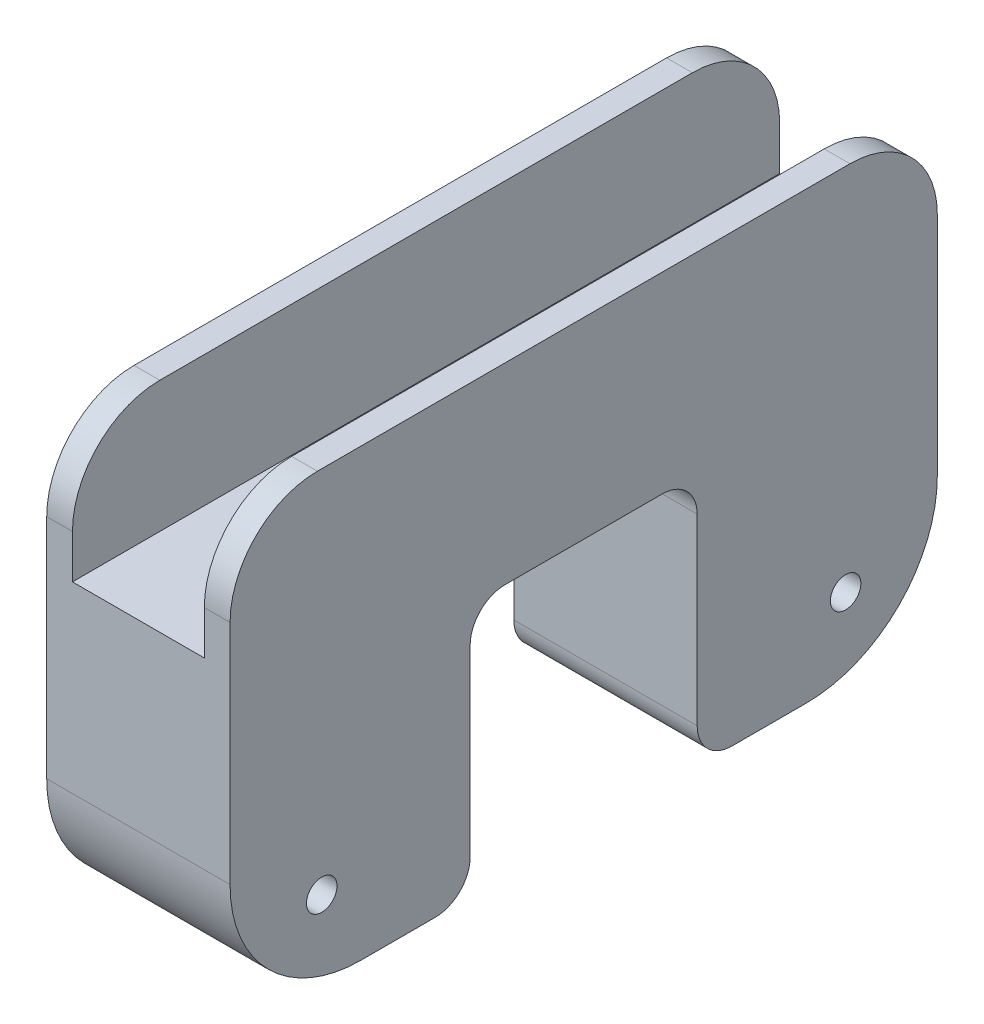
ISO-10303-21;
HEADER;
FILE_DESCRIPTION(('STEP AP214'),'2;1');
FILE_NAME('part.step','',(''),(''),'','','');
FILE_SCHEMA(('AUTOMOTIVE_DESIGN { 1 0 10303 214 1 1 1 1 }'));
ENDSEC;
DATA;
#1=APPLICATION_CONTEXT('core data for automotive mechanical design processes');
#2=APPLICATION_PROTOCOL_DEFINITION('international standard','automotive_design',2000,#1);
#3=PRODUCT_CONTEXT('',#1,'mechanical');
#4=PRODUCT('Part','Part','',(#3));
#5=PRODUCT_RELATED_PRODUCT_CATEGORY('part','',(#4));
#6=PRODUCT_DEFINITION_FORMATION('','',#4);
#7=PRODUCT_DEFINITION_CONTEXT('part definition',#1,'design');
#8=PRODUCT_DEFINITION('design','',#6,#7);
#9=PRODUCT_DEFINITION_SHAPE('','',#8);
#10=(LENGTH_UNIT() NAMED_UNIT(*) SI_UNIT(.MILLI.,.METRE.));
#11=(NAMED_UNIT(*) PLANE_ANGLE_UNIT() SI_UNIT($,.RADIAN.));
#12=(NAMED_UNIT(*) SI_UNIT($,.STERADIAN.) SOLID_ANGLE_UNIT());
#13=UNCERTAINTY_MEASURE_WITH_UNIT(LENGTH_MEASURE(1.E-05),#10,'distance_accuracy_value','');
#14=(GEOMETRIC_REPRESENTATION_CONTEXT(3) GLOBAL_UNCERTAINTY_ASSIGNED_CONTEXT((#13)) GLOBAL_UNIT_ASSIGNED_CONTEXT((#10,
#11,#12)) REPRESENTATION_CONTEXT('',''));
#15=CARTESIAN_POINT('',(0.,0.,0.));
#16=DIRECTION('',(0.,0.,1.));
#17=DIRECTION('',(1.,0.,0.));
#18=AXIS2_PLACEMENT_3D('',#15,#16,#17);
#19=CARTESIAN_POINT('',(0.,0.,81.));
#20=DIRECTION('',(1.,0.,0.));
#21=DIRECTION('',(0.,1.,0.));
#22=AXIS2_PLACEMENT_3D('',#19,#20,#21);
#23=PLANE('',#22);
#24=CARTESIAN_POINT('',(0.,-42.25,10.5));
#25=DIRECTION('',(1.,0.,0.));
#26=DIRECTION('',(0.,1.,0.));
#27=AXIS2_PLACEMENT_3D('',#24,#25,#26);
#28=CIRCLE('',#27,1.75);
#29=CARTESIAN_POINT('',(0.,-40.5,10.5));
#30=VERTEX_POINT('',#29);
#31=EDGE_CURVE('E380',#30,#30,#28,.T.);
#32=ORIENTED_EDGE('',*,*,#31,.T.);
#33=EDGE_LOOP('',(#32));
#34=FACE_BOUND('',#33,.T.);
#35=CARTESIAN_POINT('',(0.,-42.25,70.5));
#36=DIRECTION('',(1.,0.,0.));
#37=DIRECTION('',(0.,1.,0.));
#38=AXIS2_PLACEMENT_3D('',#35,#36,#37);
#39=CIRCLE('',#38,1.75);
#40=CARTESIAN_POINT('',(0.,-40.5,70.5));
#41=VERTEX_POINT('',#40);
#42=EDGE_CURVE('E384',#41,#41,#39,.T.);
#43=ORIENTED_EDGE('',*,*,#42,.T.);
#44=EDGE_LOOP('',(#43));
#45=FACE_BOUND('',#44,.T.);
#46=DIRECTION('',(0.,0.,-1.));
#47=VECTOR('',#46,1.);
#48=CARTESIAN_POINT('',(0.,-51.,81.));
#49=LINE('',#48,#47);
#50=CARTESIAN_POINT('',(0.,-51.,23.5));
#51=VERTEX_POINT('',#50);
#52=CARTESIAN_POINT('',(0.,-51.,15.));
#53=VERTEX_POINT('',#52);
#54=EDGE_CURVE('E252',#51,#53,#49,.T.);
#55=ORIENTED_EDGE('',*,*,#54,.F.);
#56=CARTESIAN_POINT('',(0.,-47.,23.5));
#57=DIRECTION('',(1.,0.,0.));
#58=DIRECTION('',(0.,1.,0.));
#59=AXIS2_PLACEMENT_3D('',#56,#57,#58);
#60=CIRCLE('',#59,4.);
#61=CARTESIAN_POINT('',(0.,-47.,27.5));
#62=VERTEX_POINT('',#61);
#63=EDGE_CURVE('E334',#51,#62,#60,.F.);
#64=ORIENTED_EDGE('',*,*,#63,.T.);
#65=DIRECTION('',(0.,-1.,0.));
#66=VECTOR('',#65,1.);
#67=CARTESIAN_POINT('',(0.,0.,27.5));
#68=LINE('',#67,#66);
#69=CARTESIAN_POINT('',(0.,-26.,27.5));
#70=VERTEX_POINT('',#69);
#71=EDGE_CURVE('E367',#70,#62,#68,.T.);
#72=ORIENTED_EDGE('',*,*,#71,.F.);
#73=CARTESIAN_POINT('',(0.,-26.,31.5));
#74=DIRECTION('',(1.,0.,0.));
#75=DIRECTION('',(0.,1.,0.));
#76=AXIS2_PLACEMENT_3D('',#73,#74,#75);
#77=CIRCLE('',#76,4.);
#78=CARTESIAN_POINT('',(0.,-22.,31.5));
#79=VERTEX_POINT('',#78);
#80=EDGE_CURVE('E11',#70,#79,#77,.T.);
#81=ORIENTED_EDGE('',*,*,#80,.T.);
#82=DIRECTION('',(0.,0.,-1.));
#83=VECTOR('',#82,1.);
#84=CARTESIAN_POINT('',(0.,-22.,81.));
#85=LINE('',#84,#83);
#86=CARTESIAN_POINT('',(0.,-22.,49.5));
#87=VERTEX_POINT('',#86);
#88=EDGE_CURVE('E365',#87,#79,#85,.T.);
#89=ORIENTED_EDGE('',*,*,#88,.F.);
#90=CARTESIAN_POINT('',(0.,-26.,49.5));
#91=DIRECTION('',(1.,0.,0.));
#92=DIRECTION('',(0.,1.,0.));
#93=AXIS2_PLACEMENT_3D('',#90,#91,#92);
#94=CIRCLE('',#93,4.);
#95=CARTESIAN_POINT('',(0.,-26.,53.5));
#96=VERTEX_POINT('',#95);
#97=EDGE_CURVE('E341',#87,#96,#94,.T.);
#98=ORIENTED_EDGE('',*,*,#97,.T.);
#99=DIRECTION('',(0.,-1.,0.));
#100=VECTOR('',#99,1.);
#101=CARTESIAN_POINT('',(0.,0.,53.5));
#102=LINE('',#101,#100);
#103=CARTESIAN_POINT('',(0.,-47.,53.5));
#104=VERTEX_POINT('',#103);
#105=EDGE_CURVE('E358',#96,#104,#102,.T.);
#106=ORIENTED_EDGE('',*,*,#105,.T.);
#107=CARTESIAN_POINT('',(0.,-47.,57.5));
#108=DIRECTION('',(1.,0.,0.));
#109=DIRECTION('',(0.,1.,0.));
#110=AXIS2_PLACEMENT_3D('',#107,#108,#109);
#111=CIRCLE('',#110,4.);
#112=CARTESIAN_POINT('',(0.,-51.,57.5));
#113=VERTEX_POINT('',#112);
#114=EDGE_CURVE('E55',#104,#113,#111,.F.);
#115=ORIENTED_EDGE('',*,*,#114,.T.);
#116=CARTESIAN_POINT('',(0.,-51.,66.));
#117=VERTEX_POINT('',#116);
#118=EDGE_CURVE('E253',#117,#113,#49,.T.);
#119=ORIENTED_EDGE('',*,*,#118,.F.);
#120=CARTESIAN_POINT('',(0.,-36.,66.));
#121=DIRECTION('',(1.,0.,0.));
#122=DIRECTION('',(0.,1.,0.));
#123=AXIS2_PLACEMENT_3D('',#120,#121,#122);
#124=CIRCLE('',#123,15.);
#125=CARTESIAN_POINT('',(0.,-36.,81.));
#126=VERTEX_POINT('',#125);
#127=EDGE_CURVE('E305',#117,#126,#124,.F.);
#128=ORIENTED_EDGE('',*,*,#127,.T.);
#129=DIRECTION('',(0.,-1.,0.));
#130=VECTOR('',#129,1.);
#131=CARTESIAN_POINT('',(0.,0.,81.));
#132=LINE('',#131,#130);
#133=CARTESIAN_POINT('',(0.,-10.,81.));
#134=VERTEX_POINT('',#133);
#135=EDGE_CURVE('E202',#134,#126,#132,.T.);
#136=ORIENTED_EDGE('',*,*,#135,.F.);
#137=CARTESIAN_POINT('',(0.,-10.,71.));
#138=DIRECTION('',(1.,0.,0.));
#139=DIRECTION('',(0.,1.,0.));
#140=AXIS2_PLACEMENT_3D('',#137,#138,#139);
#141=CIRCLE('',#140,10.);
#142=CARTESIAN_POINT('',(0.,0.,71.));
#143=VERTEX_POINT('',#142);
#144=EDGE_CURVE('E273',#134,#143,#141,.F.);
#145=ORIENTED_EDGE('',*,*,#144,.T.);
#146=DIRECTION('',(0.,0.,-1.));
#147=VECTOR('',#146,1.);
#148=CARTESIAN_POINT('',(0.,0.,81.));
#149=LINE('',#148,#147);
#150=CARTESIAN_POINT('',(0.,0.,9.99999999999999));
#151=VERTEX_POINT('',#150);
#152=EDGE_CURVE('E255',#143,#151,#149,.T.);
#153=ORIENTED_EDGE('',*,*,#152,.T.);
#154=CARTESIAN_POINT('',(0.,-10.,10.));
#155=DIRECTION('',(1.,0.,0.));
#156=DIRECTION('',(0.,1.,0.));
#157=AXIS2_PLACEMENT_3D('',#154,#155,#156);
#158=CIRCLE('',#157,10.);
#159=CARTESIAN_POINT('',(0.,-10.,0.));
#160=VERTEX_POINT('',#159);
#161=EDGE_CURVE('E275',#151,#160,#158,.F.);
#162=ORIENTED_EDGE('',*,*,#161,.T.);
#163=DIRECTION('',(0.,-1.,0.));
#164=VECTOR('',#163,1.);
#165=CARTESIAN_POINT('',(0.,0.,0.));
#166=LINE('',#165,#164);
#167=CARTESIAN_POINT('',(0.,-36.,0.));
#168=VERTEX_POINT('',#167);
#169=EDGE_CURVE('E236',#160,#168,#166,.T.);
#170=ORIENTED_EDGE('',*,*,#169,.T.);
#171=CARTESIAN_POINT('',(0.,-36.,15.));
#172=DIRECTION('',(1.,0.,0.));
#173=DIRECTION('',(0.,1.,0.));
#174=AXIS2_PLACEMENT_3D('',#171,#172,#173);
#175=CIRCLE('',#174,15.);
#176=EDGE_CURVE('E307',#168,#53,#175,.F.);
#177=ORIENTED_EDGE('',*,*,#176,.T.);
#178=EDGE_LOOP('',(#55,#64,#72,#81,#89,#98,#106,#115,#119,#128,#136,#145,#153,#162,#170,#177));
#179=FACE_BOUND('',#178,.T.);
#180=ADVANCED_FACE('F40',(#34,#45,#179),#23,.F.);
#181=CARTESIAN_POINT('',(0.,-51.,81.));
#182=DIRECTION('',(0.,1.,0.));
#183=DIRECTION('',(0.,0.,1.));
#184=AXIS2_PLACEMENT_3D('',#181,#182,#183);
#185=PLANE('',#184);
#186=CARTESIAN_POINT('',(10.5,-51.,20.5));
#187=DIRECTION('',(0.,-1.,0.));
#188=DIRECTION('',(0.,0.,-1.));
#189=AXIS2_PLACEMENT_3D('',#186,#187,#188);
#190=CIRCLE('',#189,2.25);
#191=CARTESIAN_POINT('',(10.5,-51.,18.25));
#192=VERTEX_POINT('',#191);
#193=EDGE_CURVE('E387',#192,#192,#190,.T.);
#194=ORIENTED_EDGE('',*,*,#193,.F.);
#195=EDGE_LOOP('',(#194));
#196=FACE_BOUND('',#195,.T.);
#197=DIRECTION('',(0.,0.,-1.));
#198=VECTOR('',#197,1.);
#199=CARTESIAN_POINT('',(21.,-51.,81.));
#200=LINE('',#199,#198);
#201=CARTESIAN_POINT('',(21.,-51.,23.5));
#202=VERTEX_POINT('',#201);
#203=CARTESIAN_POINT('',(21.,-51.,15.));
#204=VERTEX_POINT('',#203);
#205=EDGE_CURVE('E248',#202,#204,#200,.T.);
#206=ORIENTED_EDGE('',*,*,#205,.F.);
#207=DIRECTION('',(1.,0.,0.));
#208=VECTOR('',#207,1.);
#209=CARTESIAN_POINT('',(0.,-51.,23.5));
#210=LINE('',#209,#208);
#211=EDGE_CURVE('E63',#202,#51,#210,.F.);
#212=ORIENTED_EDGE('',*,*,#211,.T.);
#213=ORIENTED_EDGE('',*,*,#54,.T.);
#214=DIRECTION('',(1.,0.,0.));
#215=VECTOR('',#214,1.);
#216=CARTESIAN_POINT('',(0.,-51.,15.));
#217=LINE('',#216,#215);
#218=EDGE_CURVE('E296',#53,#204,#217,.T.);
#219=ORIENTED_EDGE('',*,*,#218,.T.);
#220=EDGE_LOOP('',(#206,#212,#213,#219));
#221=FACE_BOUND('',#220,.T.);
#222=ADVANCED_FACE('F411',(#196,#221),#185,.F.);
#223=CARTESIAN_POINT('',(21.,0.,81.));
#224=DIRECTION('',(1.,0.,0.));
#225=DIRECTION('',(0.,1.,0.));
#226=AXIS2_PLACEMENT_3D('',#223,#224,#225);
#227=PLANE('',#226);
#228=CARTESIAN_POINT('',(21.,-42.25,70.5));
#229=DIRECTION('',(1.,0.,0.));
#230=DIRECTION('',(0.,1.,0.));
#231=AXIS2_PLACEMENT_3D('',#228,#229,#230);
#232=CIRCLE('',#231,1.75);
#233=CARTESIAN_POINT('',(21.,-40.5,70.5));
#234=VERTEX_POINT('',#233);
#235=EDGE_CURVE('E374',#234,#234,#232,.T.);
#236=ORIENTED_EDGE('',*,*,#235,.F.);
#237=EDGE_LOOP('',(#236));
#238=FACE_BOUND('',#237,.T.);
#239=CARTESIAN_POINT('',(21.,-42.25,10.5));
#240=DIRECTION('',(1.,0.,0.));
#241=DIRECTION('',(0.,1.,0.));
#242=AXIS2_PLACEMENT_3D('',#239,#240,#241);
#243=CIRCLE('',#242,1.75);
#244=CARTESIAN_POINT('',(21.,-40.5,10.5));
#245=VERTEX_POINT('',#244);
#246=EDGE_CURVE('E371',#245,#245,#243,.T.);
#247=ORIENTED_EDGE('',*,*,#246,.F.);
#248=EDGE_LOOP('',(#247));
#249=FACE_BOUND('',#248,.T.);
#250=DIRECTION('',(0.,-1.,0.));
#251=VECTOR('',#250,1.);
#252=CARTESIAN_POINT('',(21.,0.,27.5));
#253=LINE('',#252,#251);
#254=CARTESIAN_POINT('',(21.,-26.,27.5));
#255=VERTEX_POINT('',#254);
#256=CARTESIAN_POINT('',(21.,-47.,27.5));
#257=VERTEX_POINT('',#256);
#258=EDGE_CURVE('E347',#255,#257,#253,.T.);
#259=ORIENTED_EDGE('',*,*,#258,.T.);
#260=CARTESIAN_POINT('',(21.,-47.,23.5));
#261=DIRECTION('',(1.,0.,0.));
#262=DIRECTION('',(0.,1.,0.));
#263=AXIS2_PLACEMENT_3D('',#260,#261,#262);
#264=CIRCLE('',#263,4.);
#265=EDGE_CURVE('E330',#257,#202,#264,.T.);
#266=ORIENTED_EDGE('',*,*,#265,.T.);
#267=ORIENTED_EDGE('',*,*,#205,.T.);
#268=CARTESIAN_POINT('',(21.,-36.,15.));
#269=DIRECTION('',(1.,0.,0.));
#270=DIRECTION('',(0.,1.,0.));
#271=AXIS2_PLACEMENT_3D('',#268,#269,#270);
#272=CIRCLE('',#271,15.);
#273=CARTESIAN_POINT('',(21.,-36.,0.));
#274=VERTEX_POINT('',#273);
#275=EDGE_CURVE('E301',#204,#274,#272,.T.);
#276=ORIENTED_EDGE('',*,*,#275,.T.);
#277=DIRECTION('',(0.,-1.,0.));
#278=VECTOR('',#277,1.);
#279=CARTESIAN_POINT('',(21.,0.,0.));
#280=LINE('',#279,#278);
#281=CARTESIAN_POINT('',(21.,-10.,0.));
#282=VERTEX_POINT('',#281);
#283=EDGE_CURVE('E221',#282,#274,#280,.T.);
#284=ORIENTED_EDGE('',*,*,#283,.F.);
#285=CARTESIAN_POINT('',(21.,-10.,10.));
#286=DIRECTION('',(1.,0.,0.));
#287=DIRECTION('',(0.,1.,0.));
#288=AXIS2_PLACEMENT_3D('',#285,#286,#287);
#289=CIRCLE('',#288,10.);
#290=CARTESIAN_POINT('',(21.,0.,9.99999999999999));
#291=VERTEX_POINT('',#290);
#292=EDGE_CURVE('E279',#282,#291,#289,.T.);
#293=ORIENTED_EDGE('',*,*,#292,.T.);
#294=DIRECTION('',(0.,0.,-1.));
#295=VECTOR('',#294,1.);
#296=CARTESIAN_POINT('',(21.,0.,81.));
#297=LINE('',#296,#295);
#298=CARTESIAN_POINT('',(21.,0.,71.));
#299=VERTEX_POINT('',#298);
#300=EDGE_CURVE('E245',#299,#291,#297,.T.);
#301=ORIENTED_EDGE('',*,*,#300,.F.);
#302=CARTESIAN_POINT('',(21.,-10.,71.));
#303=DIRECTION('',(1.,0.,0.));
#304=DIRECTION('',(0.,1.,0.));
#305=AXIS2_PLACEMENT_3D('',#302,#303,#304);
#306=CIRCLE('',#305,10.);
#307=CARTESIAN_POINT('',(21.,-10.,81.));
#308=VERTEX_POINT('',#307);
#309=EDGE_CURVE('E277',#299,#308,#306,.T.);
#310=ORIENTED_EDGE('',*,*,#309,.T.);
#311=DIRECTION('',(0.,-1.,0.));
#312=VECTOR('',#311,1.);
#313=CARTESIAN_POINT('',(21.,0.,81.));
#314=LINE('',#313,#312);
#315=CARTESIAN_POINT('',(21.,-36.,81.));
#316=VERTEX_POINT('',#315);
#317=EDGE_CURVE('E228',#308,#316,#314,.T.);
#318=ORIENTED_EDGE('',*,*,#317,.T.);
#319=CARTESIAN_POINT('',(21.,-36.,66.));
#320=DIRECTION('',(1.,0.,0.));
#321=DIRECTION('',(0.,1.,0.));
#322=AXIS2_PLACEMENT_3D('',#319,#320,#321);
#323=CIRCLE('',#322,15.);
#324=CARTESIAN_POINT('',(21.,-51.,66.));
#325=VERTEX_POINT('',#324);
#326=EDGE_CURVE('E299',#316,#325,#323,.T.);
#327=ORIENTED_EDGE('',*,*,#326,.T.);
#328=CARTESIAN_POINT('',(21.,-51.,57.5));
#329=VERTEX_POINT('',#328);
#330=EDGE_CURVE('E249',#325,#329,#200,.T.);
#331=ORIENTED_EDGE('',*,*,#330,.T.);
#332=CARTESIAN_POINT('',(21.,-47.,57.5));
#333=DIRECTION('',(1.,0.,0.));
#334=DIRECTION('',(0.,1.,0.));
#335=AXIS2_PLACEMENT_3D('',#332,#333,#334);
#336=CIRCLE('',#335,4.);
#337=CARTESIAN_POINT('',(21.,-47.,53.5));
#338=VERTEX_POINT('',#337);
#339=EDGE_CURVE('E328',#329,#338,#336,.T.);
#340=ORIENTED_EDGE('',*,*,#339,.T.);
#341=DIRECTION('',(0.,-1.,0.));
#342=VECTOR('',#341,1.);
#343=CARTESIAN_POINT('',(21.,0.,53.5));
#344=LINE('',#343,#342);
#345=CARTESIAN_POINT('',(21.,-26.,53.5));
#346=VERTEX_POINT('',#345);
#347=EDGE_CURVE('E359',#346,#338,#344,.T.);
#348=ORIENTED_EDGE('',*,*,#347,.F.);
#349=CARTESIAN_POINT('',(21.,-26.,49.5));
#350=DIRECTION('',(1.,0.,0.));
#351=DIRECTION('',(0.,1.,0.));
#352=AXIS2_PLACEMENT_3D('',#349,#350,#351);
#353=CIRCLE('',#352,4.);
#354=CARTESIAN_POINT('',(21.,-22.,49.5));
#355=VERTEX_POINT('',#354);
#356=EDGE_CURVE('E339',#346,#355,#353,.F.);
#357=ORIENTED_EDGE('',*,*,#356,.T.);
#358=DIRECTION('',(0.,0.,-1.));
#359=VECTOR('',#358,1.);
#360=CARTESIAN_POINT('',(21.,-22.,0.));
#361=LINE('',#360,#359);
#362=CARTESIAN_POINT('',(21.,-22.,31.5));
#363=VERTEX_POINT('',#362);
#364=EDGE_CURVE('E349',#355,#363,#361,.T.);
#365=ORIENTED_EDGE('',*,*,#364,.T.);
#366=CARTESIAN_POINT('',(21.,-26.,31.5));
#367=DIRECTION('',(1.,0.,0.));
#368=DIRECTION('',(0.,1.,0.));
#369=AXIS2_PLACEMENT_3D('',#366,#367,#368);
#370=CIRCLE('',#369,4.);
#371=EDGE_CURVE('E48',#363,#255,#370,.F.);
#372=ORIENTED_EDGE('',*,*,#371,.T.);
#373=EDGE_LOOP('',(#259,#266,#267,#276,#284,#293,#301,#310,#318,#327,#331,#340,#348,#357,#365,#372));
#374=FACE_BOUND('',#373,.T.);
#375=ADVANCED_FACE('F346',(#238,#249,#374),#227,.T.);
#376=CARTESIAN_POINT('',(0.,-15.,81.));
#377=DIRECTION('',(0.,1.,0.));
#378=DIRECTION('',(-1.,0.,0.));
#379=AXIS2_PLACEMENT_3D('',#376,#377,#378);
#380=PLANE('',#379);
#381=CARTESIAN_POINT('',(10.5,-15.,60.5));
#382=DIRECTION('',(0.,1.,0.));
#383=DIRECTION('',(-1.,0.,0.));
#384=AXIS2_PLACEMENT_3D('',#381,#382,#383);
#385=CIRCLE('',#384,2.25);
#386=CARTESIAN_POINT('',(8.25,-15.,60.5));
#387=VERTEX_POINT('',#386);
#388=EDGE_CURVE('E224',#387,#387,#385,.T.);
#389=ORIENTED_EDGE('',*,*,#388,.F.);
#390=EDGE_LOOP('',(#389));
#391=FACE_BOUND('',#390,.T.);
#392=CARTESIAN_POINT('',(10.5,-15.,20.5));
#393=DIRECTION('',(0.,1.,0.));
#394=DIRECTION('',(-1.,0.,0.));
#395=AXIS2_PLACEMENT_3D('',#392,#393,#394);
#396=CIRCLE('',#395,2.25);
#397=CARTESIAN_POINT('',(8.25000000000001,-15.,20.5));
#398=VERTEX_POINT('',#397);
#399=EDGE_CURVE('E391',#398,#398,#396,.T.);
#400=ORIENTED_EDGE('',*,*,#399,.F.);
#401=EDGE_LOOP('',(#400));
#402=FACE_BOUND('',#401,.T.);
#403=DIRECTION('',(1.,0.,0.));
#404=VECTOR('',#403,1.);
#405=CARTESIAN_POINT('',(0.,-15.,0.));
#406=LINE('',#405,#404);
#407=CARTESIAN_POINT('',(2.95,-15.,0.));
#408=VERTEX_POINT('',#407);
#409=CARTESIAN_POINT('',(18.05,-15.,0.));
#410=VERTEX_POINT('',#409);
#411=EDGE_CURVE('E210',#408,#410,#406,.T.);
#412=ORIENTED_EDGE('',*,*,#411,.F.);
#413=DIRECTION('',(0.,0.,-1.));
#414=VECTOR('',#413,1.);
#415=CARTESIAN_POINT('',(2.95,-15.,81.));
#416=LINE('',#415,#414);
#417=CARTESIAN_POINT('',(2.95,-15.,81.));
#418=VERTEX_POINT('',#417);
#419=EDGE_CURVE('E195',#418,#408,#416,.T.);
#420=ORIENTED_EDGE('',*,*,#419,.F.);
#421=DIRECTION('',(1.,0.,0.));
#422=VECTOR('',#421,1.);
#423=CARTESIAN_POINT('',(0.,-15.,81.));
#424=LINE('',#423,#422);
#425=CARTESIAN_POINT('',(18.05,-15.,81.));
#426=VERTEX_POINT('',#425);
#427=EDGE_CURVE('E203',#418,#426,#424,.T.);
#428=ORIENTED_EDGE('',*,*,#427,.T.);
#429=DIRECTION('',(0.,0.,-1.));
#430=VECTOR('',#429,1.);
#431=CARTESIAN_POINT('',(18.05,-15.,81.));
#432=LINE('',#431,#430);
#433=EDGE_CURVE('E232',#426,#410,#432,.T.);
#434=ORIENTED_EDGE('',*,*,#433,.T.);
#435=EDGE_LOOP('',(#412,#420,#428,#434));
#436=FACE_BOUND('',#435,.T.);
#437=ADVANCED_FACE('F207',(#391,#402,#436),#380,.T.);
#438=CARTESIAN_POINT('',(2.95,0.,81.));
#439=DIRECTION('',(1.,0.,0.));
#440=DIRECTION('',(0.,1.,0.));
#441=AXIS2_PLACEMENT_3D('',#438,#439,#440);
#442=PLANE('',#441);
#443=DIRECTION('',(0.,-1.,0.));
#444=VECTOR('',#443,1.);
#445=CARTESIAN_POINT('',(2.95,0.,0.));
#446=LINE('',#445,#444);
#447=CARTESIAN_POINT('',(2.95,-10.,0.));
#448=VERTEX_POINT('',#447);
#449=EDGE_CURVE('E234',#448,#408,#446,.T.);
#450=ORIENTED_EDGE('',*,*,#449,.F.);
#451=CARTESIAN_POINT('',(2.95,-10.,10.));
#452=DIRECTION('',(1.,0.,0.));
#453=DIRECTION('',(0.,1.,0.));
#454=AXIS2_PLACEMENT_3D('',#451,#452,#453);
#455=CIRCLE('',#454,10.);
#456=CARTESIAN_POINT('',(2.95,0.,9.99999999999999));
#457=VERTEX_POINT('',#456);
#458=EDGE_CURVE('E266',#448,#457,#455,.T.);
#459=ORIENTED_EDGE('',*,*,#458,.T.);
#460=DIRECTION('',(0.,0.,-1.));
#461=VECTOR('',#460,1.);
#462=CARTESIAN_POINT('',(2.95,0.,81.));
#463=LINE('',#462,#461);
#464=CARTESIAN_POINT('',(2.95,0.,71.));
#465=VERTEX_POINT('',#464);
#466=EDGE_CURVE('E212',#465,#457,#463,.T.);
#467=ORIENTED_EDGE('',*,*,#466,.F.);
#468=CARTESIAN_POINT('',(2.95,-10.,71.));
#469=DIRECTION('',(1.,0.,0.));
#470=DIRECTION('',(0.,1.,0.));
#471=AXIS2_PLACEMENT_3D('',#468,#469,#470);
#472=CIRCLE('',#471,10.);
#473=CARTESIAN_POINT('',(2.95,-10.,81.));
#474=VERTEX_POINT('',#473);
#475=EDGE_CURVE('E198',#465,#474,#472,.T.);
#476=ORIENTED_EDGE('',*,*,#475,.T.);
#477=DIRECTION('',(0.,-1.,0.));
#478=VECTOR('',#477,1.);
#479=CARTESIAN_POINT('',(2.95,0.,81.));
#480=LINE('',#479,#478);
#481=EDGE_CURVE('E191',#474,#418,#480,.T.);
#482=ORIENTED_EDGE('',*,*,#481,.T.);
#483=ORIENTED_EDGE('',*,*,#419,.T.);
#484=EDGE_LOOP('',(#450,#459,#467,#476,#482,#483));
#485=FACE_BOUND('',#484,.T.);
#486=ADVANCED_FACE('F194',(#485),#442,.T.);
#487=CARTESIAN_POINT('',(0.,0.,81.));
#488=DIRECTION('',(0.,1.,0.));
#489=DIRECTION('',(0.,0.,1.));
#490=AXIS2_PLACEMENT_3D('',#487,#488,#489);
#491=PLANE('',#490);
#492=ORIENTED_EDGE('',*,*,#466,.T.);
#493=DIRECTION('',(1.,0.,0.));
#494=VECTOR('',#493,1.);
#495=CARTESIAN_POINT('',(0.,0.,10.));
#496=LINE('',#495,#494);
#497=EDGE_CURVE('E271',#457,#151,#496,.F.);
#498=ORIENTED_EDGE('',*,*,#497,.T.);
#499=ORIENTED_EDGE('',*,*,#152,.F.);
#500=DIRECTION('',(1.,0.,0.));
#501=VECTOR('',#500,1.);
#502=CARTESIAN_POINT('',(0.,0.,71.));
#503=LINE('',#502,#501);
#504=EDGE_CURVE('E268',#143,#465,#503,.T.);
#505=ORIENTED_EDGE('',*,*,#504,.T.);
#506=EDGE_LOOP('',(#492,#498,#499,#505));
#507=FACE_BOUND('',#506,.T.);
#508=ADVANCED_FACE('F409',(#507),#491,.T.);
#509=CARTESIAN_POINT('',(10.5,-51.,60.5));
#510=DIRECTION('',(0.,-1.,0.));
#511=DIRECTION('',(0.,0.,-1.));
#512=AXIS2_PLACEMENT_3D('',#509,#510,#511);
#513=CIRCLE('',#512,2.25);
#514=CARTESIAN_POINT('',(10.5,-51.,58.25));
#515=VERTEX_POINT('',#514);
#516=EDGE_CURVE('E388',#515,#515,#513,.T.);
#517=ORIENTED_EDGE('',*,*,#516,.F.);
#518=EDGE_LOOP('',(#517));
#519=FACE_BOUND('',#518,.T.);
#520=ORIENTED_EDGE('',*,*,#118,.T.);
#521=DIRECTION('',(1.,0.,0.));
#522=VECTOR('',#521,1.);
#523=CARTESIAN_POINT('',(0.,-51.,57.5));
#524=LINE('',#523,#522);
#525=EDGE_CURVE('E336',#113,#329,#524,.T.);
#526=ORIENTED_EDGE('',*,*,#525,.T.);
#527=ORIENTED_EDGE('',*,*,#330,.F.);
#528=DIRECTION('',(1.,0.,0.));
#529=VECTOR('',#528,1.);
#530=CARTESIAN_POINT('',(0.,-51.,66.));
#531=LINE('',#530,#529);
#532=EDGE_CURVE('E294',#325,#117,#531,.F.);
#533=ORIENTED_EDGE('',*,*,#532,.T.);
#534=EDGE_LOOP('',(#520,#526,#527,#533));
#535=FACE_BOUND('',#534,.T.);
#536=ADVANCED_FACE('F423',(#519,#535),#185,.F.);
#537=CARTESIAN_POINT('',(0.,0.,81.));
#538=DIRECTION('',(0.,1.,0.));
#539=DIRECTION('',(0.,0.,1.));
#540=AXIS2_PLACEMENT_3D('',#537,#538,#539);
#541=PLANE('',#540);
#542=ORIENTED_EDGE('',*,*,#300,.T.);
#543=DIRECTION('',(1.,0.,0.));
#544=VECTOR('',#543,1.);
#545=CARTESIAN_POINT('',(18.05,0.,10.));
#546=LINE('',#545,#544);
#547=CARTESIAN_POINT('',(18.05,0.,9.99999999999999));
#548=VERTEX_POINT('',#547);
#549=EDGE_CURVE('E284',#291,#548,#546,.F.);
#550=ORIENTED_EDGE('',*,*,#549,.T.);
#551=DIRECTION('',(0.,0.,-1.));
#552=VECTOR('',#551,1.);
#553=CARTESIAN_POINT('',(18.05,0.,81.));
#554=LINE('',#553,#552);
#555=CARTESIAN_POINT('',(18.05,0.,71.));
#556=VERTEX_POINT('',#555);
#557=EDGE_CURVE('E242',#556,#548,#554,.T.);
#558=ORIENTED_EDGE('',*,*,#557,.F.);
#559=DIRECTION('',(1.,0.,0.));
#560=VECTOR('',#559,1.);
#561=CARTESIAN_POINT('',(0.,0.,71.));
#562=LINE('',#561,#560);
#563=EDGE_CURVE('E281',#556,#299,#562,.T.);
#564=ORIENTED_EDGE('',*,*,#563,.T.);
#565=EDGE_LOOP('',(#542,#550,#558,#564));
#566=FACE_BOUND('',#565,.T.);
#567=ADVANCED_FACE('F431',(#566),#541,.T.);
#568=CARTESIAN_POINT('',(18.05,0.,81.));
#569=DIRECTION('',(1.,0.,0.));
#570=DIRECTION('',(0.,1.,0.));
#571=AXIS2_PLACEMENT_3D('',#568,#569,#570);
#572=PLANE('',#571);
#573=ORIENTED_EDGE('',*,*,#557,.T.);
#574=CARTESIAN_POINT('',(18.05,-10.,10.));
#575=DIRECTION('',(1.,0.,0.));
#576=DIRECTION('',(0.,1.,0.));
#577=AXIS2_PLACEMENT_3D('',#574,#575,#576);
#578=CIRCLE('',#577,10.);
#579=CARTESIAN_POINT('',(18.05,-10.,0.));
#580=VERTEX_POINT('',#579);
#581=EDGE_CURVE('E288',#548,#580,#578,.F.);
#582=ORIENTED_EDGE('',*,*,#581,.T.);
#583=DIRECTION('',(0.,-1.,0.));
#584=VECTOR('',#583,1.);
#585=CARTESIAN_POINT('',(18.05,0.,0.));
#586=LINE('',#585,#584);
#587=EDGE_CURVE('E219',#580,#410,#586,.T.);
#588=ORIENTED_EDGE('',*,*,#587,.T.);
#589=ORIENTED_EDGE('',*,*,#433,.F.);
#590=DIRECTION('',(0.,-1.,0.));
#591=VECTOR('',#590,1.);
#592=CARTESIAN_POINT('',(18.05,0.,81.));
#593=LINE('',#592,#591);
#594=CARTESIAN_POINT('',(18.05,-10.,81.));
#595=VERTEX_POINT('',#594);
#596=EDGE_CURVE('E217',#595,#426,#593,.T.);
#597=ORIENTED_EDGE('',*,*,#596,.F.);
#598=CARTESIAN_POINT('',(18.05,-10.,71.));
#599=DIRECTION('',(1.,0.,0.));
#600=DIRECTION('',(0.,1.,0.));
#601=AXIS2_PLACEMENT_3D('',#598,#599,#600);
#602=CIRCLE('',#601,10.);
#603=EDGE_CURVE('E286',#595,#556,#602,.F.);
#604=ORIENTED_EDGE('',*,*,#603,.T.);
#605=EDGE_LOOP('',(#573,#582,#588,#589,#597,#604));
#606=FACE_BOUND('',#605,.T.);
#607=ADVANCED_FACE('F464',(#606),#572,.F.);
#608=CARTESIAN_POINT('',(0.,0.,81.));
#609=DIRECTION('',(0.,0.,1.));
#610=DIRECTION('',(1.,0.,0.));
#611=AXIS2_PLACEMENT_3D('',#608,#609,#610);
#612=PLANE('',#611);
#613=ORIENTED_EDGE('',*,*,#135,.T.);
#614=DIRECTION('',(1.,0.,0.));
#615=VECTOR('',#614,1.);
#616=CARTESIAN_POINT('',(21.,-36.,81.));
#617=LINE('',#616,#615);
#618=EDGE_CURVE('E310',#126,#316,#617,.T.);
#619=ORIENTED_EDGE('',*,*,#618,.T.);
#620=ORIENTED_EDGE('',*,*,#317,.F.);
#621=DIRECTION('',(1.,0.,0.));
#622=VECTOR('',#621,1.);
#623=CARTESIAN_POINT('',(0.,-10.,81.));
#624=LINE('',#623,#622);
#625=EDGE_CURVE('E292',#308,#595,#624,.F.);
#626=ORIENTED_EDGE('',*,*,#625,.T.);
#627=ORIENTED_EDGE('',*,*,#596,.T.);
#628=ORIENTED_EDGE('',*,*,#427,.F.);
#629=ORIENTED_EDGE('',*,*,#481,.F.);
#630=DIRECTION('',(1.,0.,0.));
#631=VECTOR('',#630,1.);
#632=CARTESIAN_POINT('',(0.,-10.,81.));
#633=LINE('',#632,#631);
#634=EDGE_CURVE('E290',#474,#134,#633,.F.);
#635=ORIENTED_EDGE('',*,*,#634,.T.);
#636=EDGE_LOOP('',(#613,#619,#620,#626,#627,#628,#629,#635));
#637=FACE_BOUND('',#636,.T.);
#638=ADVANCED_FACE('F215',(#637),#612,.T.);
#639=CARTESIAN_POINT('',(0.,0.,0.));
#640=DIRECTION('',(0.,0.,1.));
#641=DIRECTION('',(1.,0.,0.));
#642=AXIS2_PLACEMENT_3D('',#639,#640,#641);
#643=PLANE('',#642);
#644=ORIENTED_EDGE('',*,*,#283,.T.);
#645=DIRECTION('',(1.,0.,0.));
#646=VECTOR('',#645,1.);
#647=CARTESIAN_POINT('',(0.,-36.,0.));
#648=LINE('',#647,#646);
#649=EDGE_CURVE('E303',#274,#168,#648,.F.);
#650=ORIENTED_EDGE('',*,*,#649,.T.);
#651=ORIENTED_EDGE('',*,*,#169,.F.);
#652=DIRECTION('',(1.,0.,0.));
#653=VECTOR('',#652,1.);
#654=CARTESIAN_POINT('',(2.95,-10.,0.));
#655=LINE('',#654,#653);
#656=EDGE_CURVE('E262',#160,#448,#655,.T.);
#657=ORIENTED_EDGE('',*,*,#656,.T.);
#658=ORIENTED_EDGE('',*,*,#449,.T.);
#659=ORIENTED_EDGE('',*,*,#411,.T.);
#660=ORIENTED_EDGE('',*,*,#587,.F.);
#661=DIRECTION('',(1.,0.,0.));
#662=VECTOR('',#661,1.);
#663=CARTESIAN_POINT('',(21.,-10.,0.));
#664=LINE('',#663,#662);
#665=EDGE_CURVE('E211',#580,#282,#664,.T.);
#666=ORIENTED_EDGE('',*,*,#665,.T.);
#667=EDGE_LOOP('',(#644,#650,#651,#657,#658,#659,#660,#666));
#668=FACE_BOUND('',#667,.T.);
#669=ADVANCED_FACE('F443',(#668),#643,.F.);
#670=CARTESIAN_POINT('',(10.5,31.,20.5));
#671=DIRECTION('',(0.,-1.,0.));
#672=DIRECTION('',(0.,0.,-1.));
#673=AXIS2_PLACEMENT_3D('',#670,#671,#672);
#674=CYLINDRICAL_SURFACE('',#673,2.25);
#675=ORIENTED_EDGE('',*,*,#399,.T.);
#676=EDGE_LOOP('',(#675));
#677=FACE_BOUND('',#676,.T.);
#678=ORIENTED_EDGE('',*,*,#193,.T.);
#679=EDGE_LOOP('',(#678));
#680=FACE_BOUND('',#679,.T.);
#681=ADVANCED_FACE('F605',(#677,#680),#674,.F.);
#682=CARTESIAN_POINT('',(10.5,31.,60.5));
#683=DIRECTION('',(0.,-1.,0.));
#684=DIRECTION('',(0.,0.,-1.));
#685=AXIS2_PLACEMENT_3D('',#682,#683,#684);
#686=CYLINDRICAL_SURFACE('',#685,2.25);
#687=ORIENTED_EDGE('',*,*,#388,.T.);
#688=EDGE_LOOP('',(#687));
#689=FACE_BOUND('',#688,.T.);
#690=ORIENTED_EDGE('',*,*,#516,.T.);
#691=EDGE_LOOP('',(#690));
#692=FACE_BOUND('',#691,.T.);
#693=ADVANCED_FACE('F399',(#689,#692),#686,.F.);
#694=CARTESIAN_POINT('',(-61.,-42.25,10.5));
#695=DIRECTION('',(1.,0.,0.));
#696=DIRECTION('',(0.,1.,0.));
#697=AXIS2_PLACEMENT_3D('',#694,#695,#696);
#698=CYLINDRICAL_SURFACE('',#697,1.75);
#699=ORIENTED_EDGE('',*,*,#246,.T.);
#700=EDGE_LOOP('',(#699));
#701=FACE_BOUND('',#700,.T.);
#702=ORIENTED_EDGE('',*,*,#31,.F.);
#703=EDGE_LOOP('',(#702));
#704=FACE_BOUND('',#703,.T.);
#705=ADVANCED_FACE('F689',(#701,#704),#698,.F.);
#706=CARTESIAN_POINT('',(-61.,-42.25,70.5));
#707=DIRECTION('',(1.,0.,0.));
#708=DIRECTION('',(0.,1.,0.));
#709=AXIS2_PLACEMENT_3D('',#706,#707,#708);
#710=CYLINDRICAL_SURFACE('',#709,1.75);
#711=ORIENTED_EDGE('',*,*,#235,.T.);
#712=EDGE_LOOP('',(#711));
#713=FACE_BOUND('',#712,.T.);
#714=ORIENTED_EDGE('',*,*,#42,.F.);
#715=EDGE_LOOP('',(#714));
#716=FACE_BOUND('',#715,.T.);
#717=ADVANCED_FACE('F653',(#713,#716),#710,.F.);
#718=CARTESIAN_POINT('',(0.,-10.,10.));
#719=DIRECTION('',(-1.,0.,0.));
#720=DIRECTION('',(0.,0.,1.));
#721=AXIS2_PLACEMENT_3D('',#718,#719,#720);
#722=CYLINDRICAL_SURFACE('',#721,10.);
#723=ORIENTED_EDGE('',*,*,#161,.F.);
#724=ORIENTED_EDGE('',*,*,#497,.F.);
#725=ORIENTED_EDGE('',*,*,#458,.F.);
#726=ORIENTED_EDGE('',*,*,#656,.F.);
#727=EDGE_LOOP('',(#723,#724,#725,#726));
#728=FACE_BOUND('',#727,.T.);
#729=ADVANCED_FACE('F438',(#728),#722,.T.);
#730=CARTESIAN_POINT('',(0.,-10.,10.));
#731=DIRECTION('',(-1.,0.,0.));
#732=DIRECTION('',(0.,0.,1.));
#733=AXIS2_PLACEMENT_3D('',#730,#731,#732);
#734=CYLINDRICAL_SURFACE('',#733,10.);
#735=ORIENTED_EDGE('',*,*,#581,.F.);
#736=ORIENTED_EDGE('',*,*,#549,.F.);
#737=ORIENTED_EDGE('',*,*,#292,.F.);
#738=ORIENTED_EDGE('',*,*,#665,.F.);
#739=EDGE_LOOP('',(#735,#736,#737,#738));
#740=FACE_BOUND('',#739,.T.);
#741=ADVANCED_FACE('F461',(#740),#734,.T.);
#742=CARTESIAN_POINT('',(0.,-10.,71.));
#743=DIRECTION('',(1.,0.,0.));
#744=DIRECTION('',(0.,0.,-1.));
#745=AXIS2_PLACEMENT_3D('',#742,#743,#744);
#746=CYLINDRICAL_SURFACE('',#745,10.);
#747=ORIENTED_EDGE('',*,*,#603,.F.);
#748=ORIENTED_EDGE('',*,*,#625,.F.);
#749=ORIENTED_EDGE('',*,*,#309,.F.);
#750=ORIENTED_EDGE('',*,*,#563,.F.);
#751=EDGE_LOOP('',(#747,#748,#749,#750));
#752=FACE_BOUND('',#751,.T.);
#753=ADVANCED_FACE('F467',(#752),#746,.T.);
#754=CARTESIAN_POINT('',(0.,-10.,71.));
#755=DIRECTION('',(1.,0.,0.));
#756=DIRECTION('',(0.,0.,-1.));
#757=AXIS2_PLACEMENT_3D('',#754,#755,#756);
#758=CYLINDRICAL_SURFACE('',#757,10.);
#759=ORIENTED_EDGE('',*,*,#144,.F.);
#760=ORIENTED_EDGE('',*,*,#634,.F.);
#761=ORIENTED_EDGE('',*,*,#475,.F.);
#762=ORIENTED_EDGE('',*,*,#504,.F.);
#763=EDGE_LOOP('',(#759,#760,#761,#762));
#764=FACE_BOUND('',#763,.T.);
#765=ADVANCED_FACE('F594',(#764),#758,.T.);
#766=CARTESIAN_POINT('',(0.,-36.,15.));
#767=DIRECTION('',(1.,0.,0.));
#768=DIRECTION('',(0.,0.,-1.));
#769=AXIS2_PLACEMENT_3D('',#766,#767,#768);
#770=CYLINDRICAL_SURFACE('',#769,15.);
#771=ORIENTED_EDGE('',*,*,#176,.F.);
#772=ORIENTED_EDGE('',*,*,#649,.F.);
#773=ORIENTED_EDGE('',*,*,#275,.F.);
#774=ORIENTED_EDGE('',*,*,#218,.F.);
#775=EDGE_LOOP('',(#771,#772,#773,#774));
#776=FACE_BOUND('',#775,.T.);
#777=ADVANCED_FACE('F448',(#776),#770,.T.);
#778=CARTESIAN_POINT('',(0.,-36.,66.));
#779=DIRECTION('',(-1.,0.,0.));
#780=DIRECTION('',(0.,0.,1.));
#781=AXIS2_PLACEMENT_3D('',#778,#779,#780);
#782=CYLINDRICAL_SURFACE('',#781,15.);
#783=ORIENTED_EDGE('',*,*,#127,.F.);
#784=ORIENTED_EDGE('',*,*,#532,.F.);
#785=ORIENTED_EDGE('',*,*,#326,.F.);
#786=ORIENTED_EDGE('',*,*,#618,.F.);
#787=EDGE_LOOP('',(#783,#784,#785,#786));
#788=FACE_BOUND('',#787,.T.);
#789=ADVANCED_FACE('F474',(#788),#782,.T.);
#790=CARTESIAN_POINT('',(-34.,-22.,0.));
#791=DIRECTION('',(0.,-1.,0.));
#792=DIRECTION('',(0.,0.,-1.));
#793=AXIS2_PLACEMENT_3D('',#790,#791,#792);
#794=PLANE('',#793);
#795=ORIENTED_EDGE('',*,*,#364,.F.);
#796=DIRECTION('',(1.,0.,0.));
#797=VECTOR('',#796,1.);
#798=CARTESIAN_POINT('',(-34.,-22.,49.5));
#799=LINE('',#798,#797);
#800=EDGE_CURVE('E321',#355,#87,#799,.F.);
#801=ORIENTED_EDGE('',*,*,#800,.T.);
#802=ORIENTED_EDGE('',*,*,#88,.T.);
#803=DIRECTION('',(1.,0.,0.));
#804=VECTOR('',#803,1.);
#805=CARTESIAN_POINT('',(21.,-22.,31.5));
#806=LINE('',#805,#804);
#807=EDGE_CURVE('E318',#79,#363,#806,.T.);
#808=ORIENTED_EDGE('',*,*,#807,.T.);
#809=EDGE_LOOP('',(#795,#801,#802,#808));
#810=FACE_BOUND('',#809,.T.);
#811=ADVANCED_FACE('F369',(#810),#794,.T.);
#812=CARTESIAN_POINT('',(-34.,0.,27.5));
#813=DIRECTION('',(0.,0.,1.));
#814=DIRECTION('',(0.,-1.,0.));
#815=AXIS2_PLACEMENT_3D('',#812,#813,#814);
#816=PLANE('',#815);
#817=ORIENTED_EDGE('',*,*,#258,.F.);
#818=DIRECTION('',(1.,0.,0.));
#819=VECTOR('',#818,1.);
#820=CARTESIAN_POINT('',(0.,-26.,27.5));
#821=LINE('',#820,#819);
#822=EDGE_CURVE('E326',#255,#70,#821,.F.);
#823=ORIENTED_EDGE('',*,*,#822,.T.);
#824=ORIENTED_EDGE('',*,*,#71,.T.);
#825=DIRECTION('',(1.,0.,0.));
#826=VECTOR('',#825,1.);
#827=CARTESIAN_POINT('',(21.,-47.,27.5));
#828=LINE('',#827,#826);
#829=EDGE_CURVE('E323',#62,#257,#828,.T.);
#830=ORIENTED_EDGE('',*,*,#829,.T.);
#831=EDGE_LOOP('',(#817,#823,#824,#830));
#832=FACE_BOUND('',#831,.T.);
#833=ADVANCED_FACE('F354',(#832),#816,.T.);
#834=CARTESIAN_POINT('',(-34.,0.,53.5));
#835=DIRECTION('',(0.,0.,1.));
#836=DIRECTION('',(1.,0.,0.));
#837=AXIS2_PLACEMENT_3D('',#834,#835,#836);
#838=PLANE('',#837);
#839=ORIENTED_EDGE('',*,*,#105,.F.);
#840=DIRECTION('',(1.,0.,0.));
#841=VECTOR('',#840,1.);
#842=CARTESIAN_POINT('',(-34.,-26.,53.5));
#843=LINE('',#842,#841);
#844=EDGE_CURVE('E315',#96,#346,#843,.T.);
#845=ORIENTED_EDGE('',*,*,#844,.T.);
#846=ORIENTED_EDGE('',*,*,#347,.T.);
#847=DIRECTION('',(1.,0.,0.));
#848=VECTOR('',#847,1.);
#849=CARTESIAN_POINT('',(-34.,-47.,53.5));
#850=LINE('',#849,#848);
#851=EDGE_CURVE('E313',#338,#104,#850,.F.);
#852=ORIENTED_EDGE('',*,*,#851,.T.);
#853=EDGE_LOOP('',(#839,#845,#846,#852));
#854=FACE_BOUND('',#853,.T.);
#855=ADVANCED_FACE('F485',(#854),#838,.F.);
#856=CARTESIAN_POINT('',(-34.,-26.,49.5));
#857=DIRECTION('',(1.,0.,0.));
#858=DIRECTION('',(0.,1.,0.));
#859=AXIS2_PLACEMENT_3D('',#856,#857,#858);
#860=CYLINDRICAL_SURFACE('',#859,4.);
#861=ORIENTED_EDGE('',*,*,#97,.F.);
#862=ORIENTED_EDGE('',*,*,#800,.F.);
#863=ORIENTED_EDGE('',*,*,#356,.F.);
#864=ORIENTED_EDGE('',*,*,#844,.F.);
#865=EDGE_LOOP('',(#861,#862,#863,#864));
#866=FACE_BOUND('',#865,.T.);
#867=ADVANCED_FACE('F490',(#866),#860,.F.);
#868=CARTESIAN_POINT('',(-34.,-26.,31.5));
#869=DIRECTION('',(-1.,0.,0.));
#870=DIRECTION('',(0.,-1.,0.));
#871=AXIS2_PLACEMENT_3D('',#868,#869,#870);
#872=CYLINDRICAL_SURFACE('',#871,4.);
#873=ORIENTED_EDGE('',*,*,#80,.F.);
#874=ORIENTED_EDGE('',*,*,#822,.F.);
#875=ORIENTED_EDGE('',*,*,#371,.F.);
#876=ORIENTED_EDGE('',*,*,#807,.F.);
#877=EDGE_LOOP('',(#873,#874,#875,#876));
#878=FACE_BOUND('',#877,.T.);
#879=ADVANCED_FACE('F362',(#878),#872,.F.);
#880=CARTESIAN_POINT('',(-34.,-47.,23.5));
#881=DIRECTION('',(-1.,0.,0.));
#882=DIRECTION('',(0.,0.,1.));
#883=AXIS2_PLACEMENT_3D('',#880,#881,#882);
#884=CYLINDRICAL_SURFACE('',#883,4.);
#885=ORIENTED_EDGE('',*,*,#63,.F.);
#886=ORIENTED_EDGE('',*,*,#211,.F.);
#887=ORIENTED_EDGE('',*,*,#265,.F.);
#888=ORIENTED_EDGE('',*,*,#829,.F.);
#889=EDGE_LOOP('',(#885,#886,#887,#888));
#890=FACE_BOUND('',#889,.T.);
#891=ADVANCED_FACE('F452',(#890),#884,.T.);
#892=CARTESIAN_POINT('',(0.,-47.,57.5));
#893=DIRECTION('',(1.,0.,0.));
#894=DIRECTION('',(0.,0.,-1.));
#895=AXIS2_PLACEMENT_3D('',#892,#893,#894);
#896=CYLINDRICAL_SURFACE('',#895,4.);
#897=ORIENTED_EDGE('',*,*,#114,.F.);
#898=ORIENTED_EDGE('',*,*,#851,.F.);
#899=ORIENTED_EDGE('',*,*,#339,.F.);
#900=ORIENTED_EDGE('',*,*,#525,.F.);
#901=EDGE_LOOP('',(#897,#898,#899,#900));
#902=FACE_BOUND('',#901,.T.);
#903=ADVANCED_FACE('F42',(#902),#896,.T.);
#904=CLOSED_SHELL('',(#180,#222,#375,#437,#486,#508,#536,#567,#607,#638,#669,#681,#693,#705,
#717,#729,#741,#753,#765,#777,#789,#811,#833,#855,#867,#879,#891,#903));
#905=MANIFOLD_SOLID_BREP('B2',#904);
#906=ADVANCED_BREP_SHAPE_REPRESENTATION('',(#18,#905),#14);
#907=SHAPE_DEFINITION_REPRESENTATION(#9,#906);
ENDSEC;
END-ISO-10303-21;
